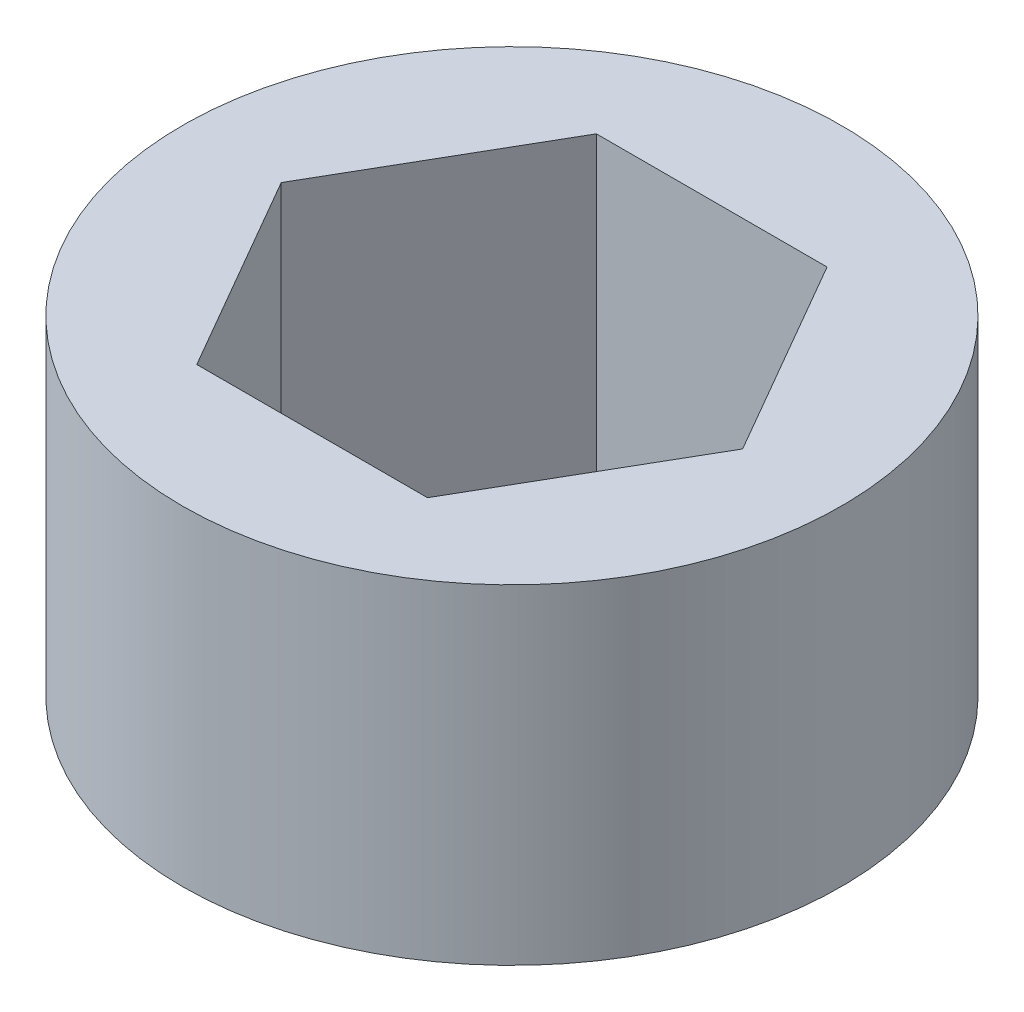
ISO-10303-21;
HEADER;
FILE_DESCRIPTION(('STEP AP214'),'2;1');
FILE_NAME('part.step','',(''),(''),'','','');
FILE_SCHEMA(('AUTOMOTIVE_DESIGN { 1 0 10303 214 1 1 1 1 }'));
ENDSEC;
DATA;
#1=APPLICATION_CONTEXT('core data for automotive mechanical design processes');
#2=APPLICATION_PROTOCOL_DEFINITION('international standard','automotive_design',2000,#1);
#3=PRODUCT_CONTEXT('',#1,'mechanical');
#4=PRODUCT('Part','Part','',(#3));
#5=PRODUCT_RELATED_PRODUCT_CATEGORY('part','',(#4));
#6=PRODUCT_DEFINITION_FORMATION('','',#4);
#7=PRODUCT_DEFINITION_CONTEXT('part definition',#1,'design');
#8=PRODUCT_DEFINITION('design','',#6,#7);
#9=PRODUCT_DEFINITION_SHAPE('','',#8);
#10=(LENGTH_UNIT() NAMED_UNIT(*) SI_UNIT(.MILLI.,.METRE.));
#11=(NAMED_UNIT(*) PLANE_ANGLE_UNIT() SI_UNIT($,.RADIAN.));
#12=(NAMED_UNIT(*) SI_UNIT($,.STERADIAN.) SOLID_ANGLE_UNIT());
#13=UNCERTAINTY_MEASURE_WITH_UNIT(LENGTH_MEASURE(1.E-05),#10,'distance_accuracy_value','');
#14=(GEOMETRIC_REPRESENTATION_CONTEXT(3) GLOBAL_UNCERTAINTY_ASSIGNED_CONTEXT((#13)) GLOBAL_UNIT_ASSIGNED_CONTEXT((#10,
#11,#12)) REPRESENTATION_CONTEXT('',''));
#15=CARTESIAN_POINT('',(0.,0.,0.));
#16=DIRECTION('',(0.,0.,1.));
#17=DIRECTION('',(1.,0.,0.));
#18=AXIS2_PLACEMENT_3D('',#15,#16,#17);
#19=CARTESIAN_POINT('',(0.,-6.35,0.));
#20=DIRECTION('',(0.,1.,0.));
#21=DIRECTION('',(0.,0.,1.));
#22=AXIS2_PLACEMENT_3D('',#19,#20,#21);
#23=CYLINDRICAL_SURFACE('',#22,6.35);
#24=CARTESIAN_POINT('',(0.,-6.35,0.));
#25=DIRECTION('',(0.,1.,0.));
#26=DIRECTION('',(0.,0.,1.));
#27=AXIS2_PLACEMENT_3D('',#24,#25,#26);
#28=CIRCLE('',#27,6.35);
#29=CARTESIAN_POINT('',(0.,-6.35,6.35));
#30=VERTEX_POINT('',#29);
#31=EDGE_CURVE('E11',#30,#30,#28,.T.);
#32=ORIENTED_EDGE('',*,*,#31,.T.);
#33=EDGE_LOOP('',(#32));
#34=FACE_BOUND('',#33,.T.);
#35=CARTESIAN_POINT('',(0.,0.,0.));
#36=DIRECTION('',(0.,1.,0.));
#37=DIRECTION('',(0.,0.,1.));
#38=AXIS2_PLACEMENT_3D('',#35,#36,#37);
#39=CIRCLE('',#38,6.35);
#40=CARTESIAN_POINT('',(0.,0.,6.35));
#41=VERTEX_POINT('',#40);
#42=EDGE_CURVE('E42',#41,#41,#39,.T.);
#43=ORIENTED_EDGE('',*,*,#42,.F.);
#44=EDGE_LOOP('',(#43));
#45=FACE_BOUND('',#44,.T.);
#46=ADVANCED_FACE('F39',(#34,#45),#23,.T.);
#47=CARTESIAN_POINT('',(0.,-6.35,0.));
#48=DIRECTION('',(0.,1.,0.));
#49=DIRECTION('',(0.,0.,1.));
#50=AXIS2_PLACEMENT_3D('',#47,#48,#49);
#51=PLANE('',#50);
#52=DIRECTION('',(0.5,0.,-0.866025403784439));
#53=VECTOR('',#52,1.);
#54=CARTESIAN_POINT('',(2.2225,-6.35,3.84948291982183));
#55=LINE('',#54,#53);
#56=CARTESIAN_POINT('',(2.2225,-6.35,3.84948291982183));
#57=VERTEX_POINT('',#56);
#58=CARTESIAN_POINT('',(4.445,-6.35,0.));
#59=VERTEX_POINT('',#58);
#60=EDGE_CURVE('E101',#57,#59,#55,.T.);
#61=ORIENTED_EDGE('',*,*,#60,.T.);
#62=DIRECTION('',(-0.5,0.,-0.866025403784439));
#63=VECTOR('',#62,1.);
#64=CARTESIAN_POINT('',(4.445,-6.35,0.));
#65=LINE('',#64,#63);
#66=CARTESIAN_POINT('',(2.2225,-6.35,-3.84948291982183));
#67=VERTEX_POINT('',#66);
#68=EDGE_CURVE('E94',#59,#67,#65,.T.);
#69=ORIENTED_EDGE('',*,*,#68,.T.);
#70=DIRECTION('',(-1.,0.,0.));
#71=VECTOR('',#70,1.);
#72=CARTESIAN_POINT('',(2.2225,-6.35,-3.84948291982183));
#73=LINE('',#72,#71);
#74=CARTESIAN_POINT('',(-2.2225,-6.35,-3.84948291982183));
#75=VERTEX_POINT('',#74);
#76=EDGE_CURVE('E104',#67,#75,#73,.T.);
#77=ORIENTED_EDGE('',*,*,#76,.T.);
#78=DIRECTION('',(-0.5,0.,0.866025403784439));
#79=VECTOR('',#78,1.);
#80=CARTESIAN_POINT('',(-2.2225,-6.35,-3.84948291982183));
#81=LINE('',#80,#79);
#82=CARTESIAN_POINT('',(-4.445,-6.35,0.));
#83=VERTEX_POINT('',#82);
#84=EDGE_CURVE('E54',#75,#83,#81,.T.);
#85=ORIENTED_EDGE('',*,*,#84,.T.);
#86=DIRECTION('',(0.5,0.,0.866025403784438));
#87=VECTOR('',#86,1.);
#88=CARTESIAN_POINT('',(-4.445,-6.35,0.));
#89=LINE('',#88,#87);
#90=CARTESIAN_POINT('',(-2.2225,-6.35,3.84948291982183));
#91=VERTEX_POINT('',#90);
#92=EDGE_CURVE('E123',#83,#91,#89,.T.);
#93=ORIENTED_EDGE('',*,*,#92,.T.);
#94=DIRECTION('',(1.,0.,0.));
#95=VECTOR('',#94,1.);
#96=CARTESIAN_POINT('',(-2.2225,-6.35,3.84948291982183));
#97=LINE('',#96,#95);
#98=EDGE_CURVE('E127',#91,#57,#97,.T.);
#99=ORIENTED_EDGE('',*,*,#98,.T.);
#100=EDGE_LOOP('',(#61,#69,#77,#85,#93,#99));
#101=FACE_BOUND('',#100,.T.);
#102=ORIENTED_EDGE('',*,*,#31,.F.);
#103=EDGE_LOOP('',(#102));
#104=FACE_BOUND('',#103,.T.);
#105=ADVANCED_FACE('F109',(#101,#104),#51,.F.);
#106=CARTESIAN_POINT('',(0.,0.,0.));
#107=DIRECTION('',(0.,1.,0.));
#108=DIRECTION('',(0.,0.,1.));
#109=AXIS2_PLACEMENT_3D('',#106,#107,#108);
#110=PLANE('',#109);
#111=DIRECTION('',(-0.5,0.,-0.866025403784439));
#112=VECTOR('',#111,1.);
#113=CARTESIAN_POINT('',(4.445,0.,0.));
#114=LINE('',#113,#112);
#115=CARTESIAN_POINT('',(4.445,0.,0.));
#116=VERTEX_POINT('',#115);
#117=CARTESIAN_POINT('',(2.2225,0.,-3.84948291982183));
#118=VERTEX_POINT('',#117);
#119=EDGE_CURVE('E62',#116,#118,#114,.T.);
#120=ORIENTED_EDGE('',*,*,#119,.F.);
#121=DIRECTION('',(0.5,0.,-0.866025403784439));
#122=VECTOR('',#121,1.);
#123=CARTESIAN_POINT('',(2.2225,0.,3.84948291982183));
#124=LINE('',#123,#122);
#125=CARTESIAN_POINT('',(2.2225,0.,3.84948291982183));
#126=VERTEX_POINT('',#125);
#127=EDGE_CURVE('E114',#126,#116,#124,.T.);
#128=ORIENTED_EDGE('',*,*,#127,.F.);
#129=DIRECTION('',(1.,0.,0.));
#130=VECTOR('',#129,1.);
#131=CARTESIAN_POINT('',(-2.2225,0.,3.84948291982183));
#132=LINE('',#131,#130);
#133=CARTESIAN_POINT('',(-2.2225,0.,3.84948291982183));
#134=VERTEX_POINT('',#133);
#135=EDGE_CURVE('E118',#134,#126,#132,.T.);
#136=ORIENTED_EDGE('',*,*,#135,.F.);
#137=DIRECTION('',(0.5,0.,0.866025403784438));
#138=VECTOR('',#137,1.);
#139=CARTESIAN_POINT('',(-4.445,0.,0.));
#140=LINE('',#139,#138);
#141=CARTESIAN_POINT('',(-4.445,0.,0.));
#142=VERTEX_POINT('',#141);
#143=EDGE_CURVE('E141',#142,#134,#140,.T.);
#144=ORIENTED_EDGE('',*,*,#143,.F.);
#145=DIRECTION('',(-0.5,0.,0.866025403784439));
#146=VECTOR('',#145,1.);
#147=CARTESIAN_POINT('',(-2.2225,0.,-3.84948291982183));
#148=LINE('',#147,#146);
#149=CARTESIAN_POINT('',(-2.2225,0.,-3.84948291982183));
#150=VERTEX_POINT('',#149);
#151=EDGE_CURVE('E137',#150,#142,#148,.T.);
#152=ORIENTED_EDGE('',*,*,#151,.F.);
#153=DIRECTION('',(-1.,0.,0.));
#154=VECTOR('',#153,1.);
#155=CARTESIAN_POINT('',(2.2225,0.,-3.84948291982183));
#156=LINE('',#155,#154);
#157=EDGE_CURVE('E134',#118,#150,#156,.T.);
#158=ORIENTED_EDGE('',*,*,#157,.F.);
#159=EDGE_LOOP('',(#120,#128,#136,#144,#152,#158));
#160=FACE_BOUND('',#159,.T.);
#161=ORIENTED_EDGE('',*,*,#42,.T.);
#162=EDGE_LOOP('',(#161));
#163=FACE_BOUND('',#162,.T.);
#164=ADVANCED_FACE('F165',(#160,#163),#110,.T.);
#165=CARTESIAN_POINT('',(4.445,-6.35,0.));
#166=DIRECTION('',(0.866025403784439,0.,-0.5));
#167=DIRECTION('',(-0.5,0.,-0.866025403784439));
#168=AXIS2_PLACEMENT_3D('',#165,#166,#167);
#169=PLANE('',#168);
#170=ORIENTED_EDGE('',*,*,#119,.T.);
#171=DIRECTION('',(0.,1.,0.));
#172=VECTOR('',#171,1.);
#173=CARTESIAN_POINT('',(2.2225,-6.35,-3.84948291982183));
#174=LINE('',#173,#172);
#175=EDGE_CURVE('E90',#67,#118,#174,.T.);
#176=ORIENTED_EDGE('',*,*,#175,.F.);
#177=ORIENTED_EDGE('',*,*,#68,.F.);
#178=DIRECTION('',(0.,1.,0.));
#179=VECTOR('',#178,1.);
#180=CARTESIAN_POINT('',(4.445,-6.35,0.));
#181=LINE('',#180,#179);
#182=EDGE_CURVE('E148',#59,#116,#181,.T.);
#183=ORIENTED_EDGE('',*,*,#182,.T.);
#184=EDGE_LOOP('',(#170,#176,#177,#183));
#185=FACE_BOUND('',#184,.T.);
#186=ADVANCED_FACE('F92',(#185),#169,.F.);
#187=CARTESIAN_POINT('',(2.2225,-6.35,3.84948291982183));
#188=DIRECTION('',(0.866025403784439,0.,0.5));
#189=DIRECTION('',(0.5,0.,-0.866025403784439));
#190=AXIS2_PLACEMENT_3D('',#187,#188,#189);
#191=PLANE('',#190);
#192=ORIENTED_EDGE('',*,*,#127,.T.);
#193=ORIENTED_EDGE('',*,*,#182,.F.);
#194=ORIENTED_EDGE('',*,*,#60,.F.);
#195=DIRECTION('',(0.,1.,0.));
#196=VECTOR('',#195,1.);
#197=CARTESIAN_POINT('',(2.2225,-6.35,3.84948291982183));
#198=LINE('',#197,#196);
#199=EDGE_CURVE('E151',#57,#126,#198,.T.);
#200=ORIENTED_EDGE('',*,*,#199,.T.);
#201=EDGE_LOOP('',(#192,#193,#194,#200));
#202=FACE_BOUND('',#201,.T.);
#203=ADVANCED_FACE('F176',(#202),#191,.F.);
#204=CARTESIAN_POINT('',(-2.2225,-6.35,3.84948291982183));
#205=DIRECTION('',(0.,0.,1.));
#206=DIRECTION('',(1.,0.,0.));
#207=AXIS2_PLACEMENT_3D('',#204,#205,#206);
#208=PLANE('',#207);
#209=ORIENTED_EDGE('',*,*,#135,.T.);
#210=ORIENTED_EDGE('',*,*,#199,.F.);
#211=ORIENTED_EDGE('',*,*,#98,.F.);
#212=DIRECTION('',(0.,1.,0.));
#213=VECTOR('',#212,1.);
#214=CARTESIAN_POINT('',(-2.2225,-6.35,3.84948291982183));
#215=LINE('',#214,#213);
#216=EDGE_CURVE('E154',#91,#134,#215,.T.);
#217=ORIENTED_EDGE('',*,*,#216,.T.);
#218=EDGE_LOOP('',(#209,#210,#211,#217));
#219=FACE_BOUND('',#218,.T.);
#220=ADVANCED_FACE('F174',(#219),#208,.F.);
#221=CARTESIAN_POINT('',(-4.445,-6.35,0.));
#222=DIRECTION('',(-0.866025403784438,0.,0.5));
#223=DIRECTION('',(0.5,0.,0.866025403784439));
#224=AXIS2_PLACEMENT_3D('',#221,#222,#223);
#225=PLANE('',#224);
#226=ORIENTED_EDGE('',*,*,#143,.T.);
#227=ORIENTED_EDGE('',*,*,#216,.F.);
#228=ORIENTED_EDGE('',*,*,#92,.F.);
#229=DIRECTION('',(0.,1.,0.));
#230=VECTOR('',#229,1.);
#231=CARTESIAN_POINT('',(-4.445,-6.35,0.));
#232=LINE('',#231,#230);
#233=EDGE_CURVE('E157',#83,#142,#232,.T.);
#234=ORIENTED_EDGE('',*,*,#233,.T.);
#235=EDGE_LOOP('',(#226,#227,#228,#234));
#236=FACE_BOUND('',#235,.T.);
#237=ADVANCED_FACE('F170',(#236),#225,.F.);
#238=CARTESIAN_POINT('',(-2.2225,-6.35,-3.84948291982183));
#239=DIRECTION('',(-0.866025403784439,0.,-0.5));
#240=DIRECTION('',(-0.5,0.,0.866025403784439));
#241=AXIS2_PLACEMENT_3D('',#238,#239,#240);
#242=PLANE('',#241);
#243=ORIENTED_EDGE('',*,*,#151,.T.);
#244=ORIENTED_EDGE('',*,*,#233,.F.);
#245=ORIENTED_EDGE('',*,*,#84,.F.);
#246=DIRECTION('',(0.,1.,0.));
#247=VECTOR('',#246,1.);
#248=CARTESIAN_POINT('',(-2.2225,-6.35,-3.84948291982183));
#249=LINE('',#248,#247);
#250=EDGE_CURVE('E100',#75,#150,#249,.T.);
#251=ORIENTED_EDGE('',*,*,#250,.T.);
#252=EDGE_LOOP('',(#243,#244,#245,#251));
#253=FACE_BOUND('',#252,.T.);
#254=ADVANCED_FACE('F161',(#253),#242,.F.);
#255=CARTESIAN_POINT('',(2.2225,-6.35,-3.84948291982183));
#256=DIRECTION('',(0.,0.,-1.));
#257=DIRECTION('',(-1.,0.,0.));
#258=AXIS2_PLACEMENT_3D('',#255,#256,#257);
#259=PLANE('',#258);
#260=ORIENTED_EDGE('',*,*,#157,.T.);
#261=ORIENTED_EDGE('',*,*,#250,.F.);
#262=ORIENTED_EDGE('',*,*,#76,.F.);
#263=ORIENTED_EDGE('',*,*,#175,.T.);
#264=EDGE_LOOP('',(#260,#261,#262,#263));
#265=FACE_BOUND('',#264,.T.);
#266=ADVANCED_FACE('F105',(#265),#259,.F.);
#267=CLOSED_SHELL('',(#46,#105,#164,#186,#203,#220,#237,#254,#266));
#268=MANIFOLD_SOLID_BREP('B2',#267);
#269=ADVANCED_BREP_SHAPE_REPRESENTATION('',(#18,#268),#14);
#270=SHAPE_DEFINITION_REPRESENTATION(#9,#269);
ENDSEC;
END-ISO-10303-21;
